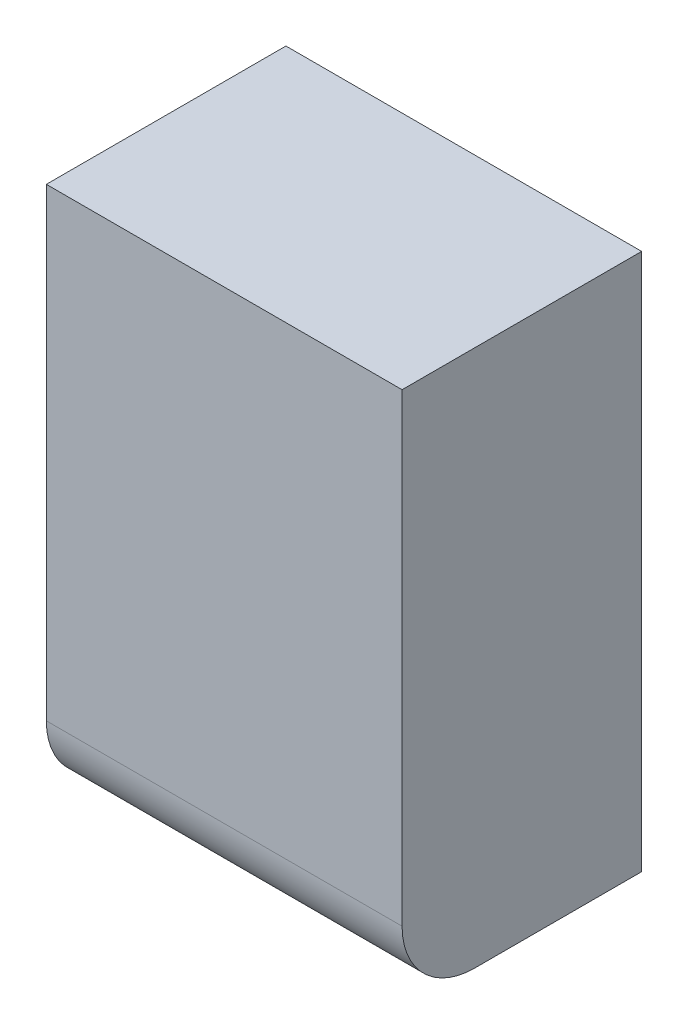
ISO-10303-21;
HEADER;
FILE_DESCRIPTION(('STEP AP214'),'2;1');
FILE_NAME('part.step','',(''),(''),'','','');
FILE_SCHEMA(('AUTOMOTIVE_DESIGN { 1 0 10303 214 1 1 1 1 }'));
ENDSEC;
DATA;
#1=APPLICATION_CONTEXT('core data for automotive mechanical design processes');
#2=APPLICATION_PROTOCOL_DEFINITION('international standard','automotive_design',2000,#1);
#3=PRODUCT_CONTEXT('',#1,'mechanical');
#4=PRODUCT('Part','Part','',(#3));
#5=PRODUCT_RELATED_PRODUCT_CATEGORY('part','',(#4));
#6=PRODUCT_DEFINITION_FORMATION('','',#4);
#7=PRODUCT_DEFINITION_CONTEXT('part definition',#1,'design');
#8=PRODUCT_DEFINITION('design','',#6,#7);
#9=PRODUCT_DEFINITION_SHAPE('','',#8);
#10=(LENGTH_UNIT() NAMED_UNIT(*) SI_UNIT(.MILLI.,.METRE.));
#11=(NAMED_UNIT(*) PLANE_ANGLE_UNIT() SI_UNIT($,.RADIAN.));
#12=(NAMED_UNIT(*) SI_UNIT($,.STERADIAN.) SOLID_ANGLE_UNIT());
#13=UNCERTAINTY_MEASURE_WITH_UNIT(LENGTH_MEASURE(1.E-05),#10,'distance_accuracy_value','');
#14=(GEOMETRIC_REPRESENTATION_CONTEXT(3) GLOBAL_UNCERTAINTY_ASSIGNED_CONTEXT((#13)) GLOBAL_UNIT_ASSIGNED_CONTEXT((#10,
#11,#12)) REPRESENTATION_CONTEXT('',''));
#15=CARTESIAN_POINT('',(0.,0.,0.));
#16=DIRECTION('',(0.,0.,1.));
#17=DIRECTION('',(1.,0.,0.));
#18=AXIS2_PLACEMENT_3D('',#15,#16,#17);
#19=CARTESIAN_POINT('',(0.,-7.4,3.3));
#20=DIRECTION('',(-1.,0.,0.));
#21=DIRECTION('',(0.,0.,1.));
#22=AXIS2_PLACEMENT_3D('',#19,#20,#21);
#23=PLANE('',#22);
#24=DIRECTION('',(0.,1.,0.));
#25=VECTOR('',#24,1.);
#26=CARTESIAN_POINT('',(0.,-7.4,3.3));
#27=LINE('',#26,#25);
#28=CARTESIAN_POINT('',(0.,-6.4,3.3));
#29=VERTEX_POINT('',#28);
#30=CARTESIAN_POINT('',(0.,0.,3.3));
#31=VERTEX_POINT('',#30);
#32=EDGE_CURVE('E77',#29,#31,#27,.T.);
#33=ORIENTED_EDGE('',*,*,#32,.F.);
#34=CARTESIAN_POINT('',(0.,-6.4,2.3));
#35=DIRECTION('',(-1.,0.,0.));
#36=DIRECTION('',(0.,0.,1.));
#37=AXIS2_PLACEMENT_3D('',#34,#35,#36);
#38=CIRCLE('',#37,1.);
#39=CARTESIAN_POINT('',(0.,-7.4,2.3));
#40=VERTEX_POINT('',#39);
#41=EDGE_CURVE('E55',#29,#40,#38,.F.);
#42=ORIENTED_EDGE('',*,*,#41,.T.);
#43=DIRECTION('',(0.,0.,-1.));
#44=VECTOR('',#43,1.);
#45=CARTESIAN_POINT('',(0.,-7.4,3.3));
#46=LINE('',#45,#44);
#47=CARTESIAN_POINT('',(0.,-7.4,0.));
#48=VERTEX_POINT('',#47);
#49=EDGE_CURVE('E107',#40,#48,#46,.T.);
#50=ORIENTED_EDGE('',*,*,#49,.T.);
#51=DIRECTION('',(0.,1.,0.));
#52=VECTOR('',#51,1.);
#53=CARTESIAN_POINT('',(0.,-7.4,0.));
#54=LINE('',#53,#52);
#55=CARTESIAN_POINT('',(0.,0.,0.));
#56=VERTEX_POINT('',#55);
#57=EDGE_CURVE('E99',#48,#56,#54,.T.);
#58=ORIENTED_EDGE('',*,*,#57,.T.);
#59=DIRECTION('',(0.,0.,-1.));
#60=VECTOR('',#59,1.);
#61=CARTESIAN_POINT('',(0.,0.,3.3));
#62=LINE('',#61,#60);
#63=EDGE_CURVE('E91',#31,#56,#62,.T.);
#64=ORIENTED_EDGE('',*,*,#63,.F.);
#65=EDGE_LOOP('',(#33,#42,#50,#58,#64));
#66=FACE_BOUND('',#65,.T.);
#67=ADVANCED_FACE('F33',(#66),#23,.F.);
#68=CARTESIAN_POINT('',(0.,0.,3.3));
#69=DIRECTION('',(0.,-1.,0.));
#70=DIRECTION('',(1.,0.,0.));
#71=AXIS2_PLACEMENT_3D('',#68,#69,#70);
#72=PLANE('',#71);
#73=DIRECTION('',(-1.,0.,0.));
#74=VECTOR('',#73,1.);
#75=CARTESIAN_POINT('',(0.,0.,0.));
#76=LINE('',#75,#74);
#77=CARTESIAN_POINT('',(-4.9,0.,0.));
#78=VERTEX_POINT('',#77);
#79=EDGE_CURVE('E114',#56,#78,#76,.T.);
#80=ORIENTED_EDGE('',*,*,#79,.T.);
#81=DIRECTION('',(0.,0.,-1.));
#82=VECTOR('',#81,1.);
#83=CARTESIAN_POINT('',(-4.9,0.,3.3));
#84=LINE('',#83,#82);
#85=CARTESIAN_POINT('',(-4.9,0.,3.3));
#86=VERTEX_POINT('',#85);
#87=EDGE_CURVE('E94',#86,#78,#84,.T.);
#88=ORIENTED_EDGE('',*,*,#87,.F.);
#89=DIRECTION('',(-1.,0.,0.));
#90=VECTOR('',#89,1.);
#91=CARTESIAN_POINT('',(0.,0.,3.3));
#92=LINE('',#91,#90);
#93=EDGE_CURVE('E81',#31,#86,#92,.T.);
#94=ORIENTED_EDGE('',*,*,#93,.F.);
#95=ORIENTED_EDGE('',*,*,#63,.T.);
#96=EDGE_LOOP('',(#80,#88,#94,#95));
#97=FACE_BOUND('',#96,.T.);
#98=ADVANCED_FACE('F90',(#97),#72,.F.);
#99=CARTESIAN_POINT('',(-4.9,0.,3.3));
#100=DIRECTION('',(1.,0.,0.));
#101=DIRECTION('',(0.,0.,-1.));
#102=AXIS2_PLACEMENT_3D('',#99,#100,#101);
#103=PLANE('',#102);
#104=DIRECTION('',(0.,0.,-1.));
#105=VECTOR('',#104,1.);
#106=CARTESIAN_POINT('',(-4.9,-7.4,3.3));
#107=LINE('',#106,#105);
#108=CARTESIAN_POINT('',(-4.9,-7.4,2.3));
#109=VERTEX_POINT('',#108);
#110=CARTESIAN_POINT('',(-4.9,-7.4,0.));
#111=VERTEX_POINT('',#110);
#112=EDGE_CURVE('E102',#109,#111,#107,.T.);
#113=ORIENTED_EDGE('',*,*,#112,.F.);
#114=CARTESIAN_POINT('',(-4.9,-6.4,2.3));
#115=DIRECTION('',(1.,0.,0.));
#116=DIRECTION('',(0.,0.,-1.));
#117=AXIS2_PLACEMENT_3D('',#114,#115,#116);
#118=CIRCLE('',#117,1.);
#119=CARTESIAN_POINT('',(-4.9,-6.4,3.3));
#120=VERTEX_POINT('',#119);
#121=EDGE_CURVE('E11',#109,#120,#118,.F.);
#122=ORIENTED_EDGE('',*,*,#121,.T.);
#123=DIRECTION('',(0.,-1.,0.));
#124=VECTOR('',#123,1.);
#125=CARTESIAN_POINT('',(-4.9,0.,3.3));
#126=LINE('',#125,#124);
#127=EDGE_CURVE('E96',#86,#120,#126,.T.);
#128=ORIENTED_EDGE('',*,*,#127,.F.);
#129=ORIENTED_EDGE('',*,*,#87,.T.);
#130=DIRECTION('',(0.,-1.,0.));
#131=VECTOR('',#130,1.);
#132=CARTESIAN_POINT('',(-4.9,0.,0.));
#133=LINE('',#132,#131);
#134=EDGE_CURVE('E111',#78,#111,#133,.T.);
#135=ORIENTED_EDGE('',*,*,#134,.T.);
#136=EDGE_LOOP('',(#113,#122,#128,#129,#135));
#137=FACE_BOUND('',#136,.T.);
#138=ADVANCED_FACE('F120',(#137),#103,.F.);
#139=CARTESIAN_POINT('',(-4.9,-7.4,3.3));
#140=DIRECTION('',(0.,1.,0.));
#141=DIRECTION('',(0.,0.,1.));
#142=AXIS2_PLACEMENT_3D('',#139,#140,#141);
#143=PLANE('',#142);
#144=ORIENTED_EDGE('',*,*,#49,.F.);
#145=DIRECTION('',(1.,0.,0.));
#146=VECTOR('',#145,1.);
#147=CARTESIAN_POINT('',(-4.9,-7.4,2.3));
#148=LINE('',#147,#146);
#149=EDGE_CURVE('E41',#40,#109,#148,.F.);
#150=ORIENTED_EDGE('',*,*,#149,.T.);
#151=ORIENTED_EDGE('',*,*,#112,.T.);
#152=DIRECTION('',(1.,0.,0.));
#153=VECTOR('',#152,1.);
#154=CARTESIAN_POINT('',(-4.9,-7.4,0.));
#155=LINE('',#154,#153);
#156=EDGE_CURVE('E86',#111,#48,#155,.T.);
#157=ORIENTED_EDGE('',*,*,#156,.T.);
#158=EDGE_LOOP('',(#144,#150,#151,#157));
#159=FACE_BOUND('',#158,.T.);
#160=ADVANCED_FACE('F123',(#159),#143,.F.);
#161=CARTESIAN_POINT('',(0.,0.,3.3));
#162=DIRECTION('',(0.,0.,1.));
#163=DIRECTION('',(1.,0.,0.));
#164=AXIS2_PLACEMENT_3D('',#161,#162,#163);
#165=PLANE('',#164);
#166=ORIENTED_EDGE('',*,*,#127,.T.);
#167=DIRECTION('',(1.,0.,0.));
#168=VECTOR('',#167,1.);
#169=CARTESIAN_POINT('',(0.,-6.4,3.3));
#170=LINE('',#169,#168);
#171=EDGE_CURVE('E84',#120,#29,#170,.T.);
#172=ORIENTED_EDGE('',*,*,#171,.T.);
#173=ORIENTED_EDGE('',*,*,#32,.T.);
#174=ORIENTED_EDGE('',*,*,#93,.T.);
#175=EDGE_LOOP('',(#166,#172,#173,#174));
#176=FACE_BOUND('',#175,.T.);
#177=ADVANCED_FACE('F80',(#176),#165,.T.);
#178=CARTESIAN_POINT('',(0.,0.,0.));
#179=DIRECTION('',(0.,0.,1.));
#180=DIRECTION('',(1.,0.,0.));
#181=AXIS2_PLACEMENT_3D('',#178,#179,#180);
#182=PLANE('',#181);
#183=ORIENTED_EDGE('',*,*,#57,.F.);
#184=ORIENTED_EDGE('',*,*,#156,.F.);
#185=ORIENTED_EDGE('',*,*,#134,.F.);
#186=ORIENTED_EDGE('',*,*,#79,.F.);
#187=EDGE_LOOP('',(#183,#184,#185,#186));
#188=FACE_BOUND('',#187,.T.);
#189=ADVANCED_FACE('F125',(#188),#182,.F.);
#190=CARTESIAN_POINT('',(0.,-6.4,2.3));
#191=DIRECTION('',(-1.,0.,0.));
#192=DIRECTION('',(0.,0.,1.));
#193=AXIS2_PLACEMENT_3D('',#190,#191,#192);
#194=CYLINDRICAL_SURFACE('',#193,1.);
#195=ORIENTED_EDGE('',*,*,#121,.F.);
#196=ORIENTED_EDGE('',*,*,#149,.F.);
#197=ORIENTED_EDGE('',*,*,#41,.F.);
#198=ORIENTED_EDGE('',*,*,#171,.F.);
#199=EDGE_LOOP('',(#195,#196,#197,#198));
#200=FACE_BOUND('',#199,.T.);
#201=ADVANCED_FACE('F35',(#200),#194,.T.);
#202=CLOSED_SHELL('',(#67,#98,#138,#160,#177,#189,#201));
#203=MANIFOLD_SOLID_BREP('B2',#202);
#204=ADVANCED_BREP_SHAPE_REPRESENTATION('',(#18,#203),#14);
#205=SHAPE_DEFINITION_REPRESENTATION(#9,#204);
ENDSEC;
END-ISO-10303-21;
